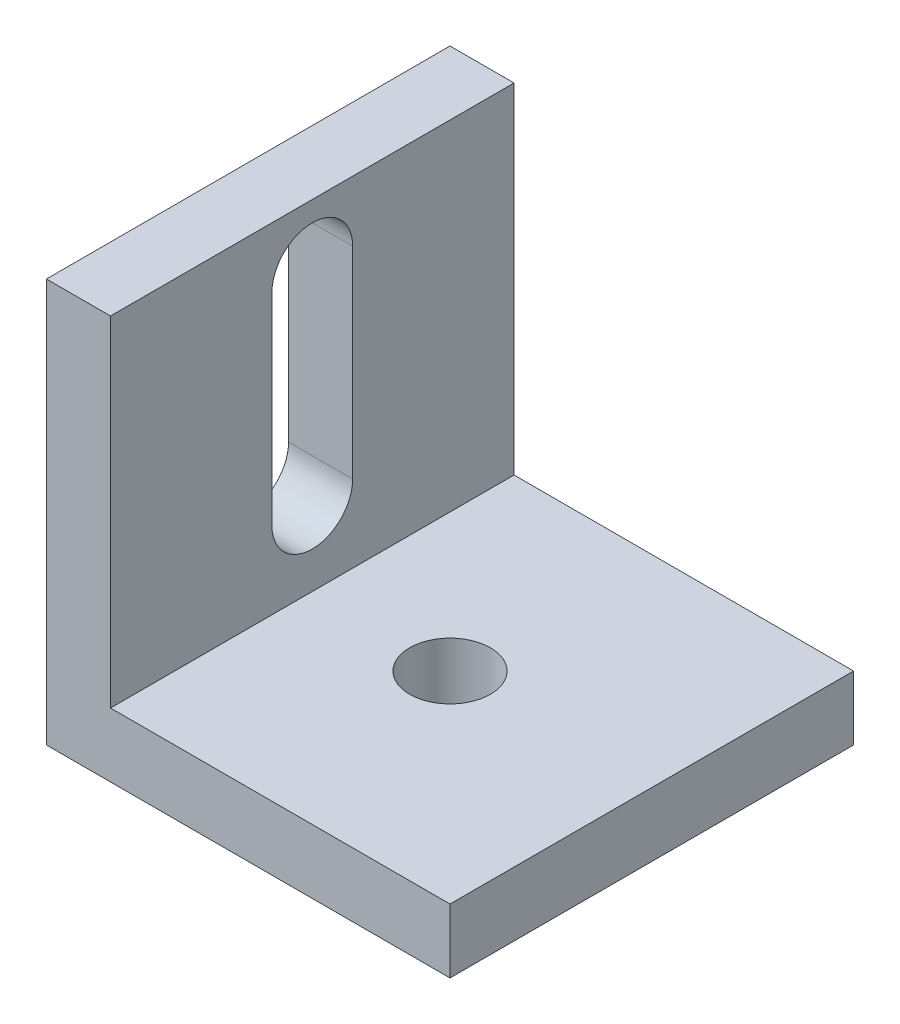
ISO-10303-21;
HEADER;
FILE_DESCRIPTION(('STEP AP214'),'2;1');
FILE_NAME('part.step','',(''),(''),'','','');
FILE_SCHEMA(('AUTOMOTIVE_DESIGN { 1 0 10303 214 1 1 1 1 }'));
ENDSEC;
DATA;
#1=APPLICATION_CONTEXT('core data for automotive mechanical design processes');
#2=APPLICATION_PROTOCOL_DEFINITION('international standard','automotive_design',2000,#1);
#3=PRODUCT_CONTEXT('',#1,'mechanical');
#4=PRODUCT('Part','Part','',(#3));
#5=PRODUCT_RELATED_PRODUCT_CATEGORY('part','',(#4));
#6=PRODUCT_DEFINITION_FORMATION('','',#4);
#7=PRODUCT_DEFINITION_CONTEXT('part definition',#1,'design');
#8=PRODUCT_DEFINITION('design','',#6,#7);
#9=PRODUCT_DEFINITION_SHAPE('','',#8);
#10=(LENGTH_UNIT() NAMED_UNIT(*) SI_UNIT(.MILLI.,.METRE.));
#11=(NAMED_UNIT(*) PLANE_ANGLE_UNIT() SI_UNIT($,.RADIAN.));
#12=(NAMED_UNIT(*) SI_UNIT($,.STERADIAN.) SOLID_ANGLE_UNIT());
#13=UNCERTAINTY_MEASURE_WITH_UNIT(LENGTH_MEASURE(1.E-05),#10,'distance_accuracy_value','');
#14=(GEOMETRIC_REPRESENTATION_CONTEXT(3) GLOBAL_UNCERTAINTY_ASSIGNED_CONTEXT((#13)) GLOBAL_UNIT_ASSIGNED_CONTEXT((#10,
#11,#12)) REPRESENTATION_CONTEXT('',''));
#15=CARTESIAN_POINT('',(0.,0.,0.));
#16=DIRECTION('',(0.,0.,1.));
#17=DIRECTION('',(1.,0.,0.));
#18=AXIS2_PLACEMENT_3D('',#15,#16,#17);
#19=CARTESIAN_POINT('',(16.825,0.,-10.));
#20=DIRECTION('',(0.,1.,0.));
#21=DIRECTION('',(-1.,0.,0.));
#22=AXIS2_PLACEMENT_3D('',#19,#20,#21);
#23=PLANE('',#22);
#24=CARTESIAN_POINT('',(6.825,0.,0.));
#25=DIRECTION('',(0.,1.,0.));
#26=DIRECTION('',(0.,0.,1.));
#27=AXIS2_PLACEMENT_3D('',#24,#25,#26);
#28=CIRCLE('',#27,2.);
#29=CARTESIAN_POINT('',(6.825,0.,2.));
#30=VERTEX_POINT('',#29);
#31=EDGE_CURVE('E145',#30,#30,#28,.T.);
#32=ORIENTED_EDGE('',*,*,#31,.F.);
#33=EDGE_LOOP('',(#32));
#34=FACE_BOUND('',#33,.T.);
#35=DIRECTION('',(0.,0.,1.));
#36=VECTOR('',#35,1.);
#37=CARTESIAN_POINT('',(0.,0.,-10.));
#38=LINE('',#37,#36);
#39=CARTESIAN_POINT('',(0.,0.,-10.));
#40=VERTEX_POINT('',#39);
#41=CARTESIAN_POINT('',(0.,0.,10.));
#42=VERTEX_POINT('',#41);
#43=EDGE_CURVE('E183',#40,#42,#38,.T.);
#44=ORIENTED_EDGE('',*,*,#43,.T.);
#45=DIRECTION('',(-1.,0.,0.));
#46=VECTOR('',#45,1.);
#47=CARTESIAN_POINT('',(16.825,0.,10.));
#48=LINE('',#47,#46);
#49=CARTESIAN_POINT('',(16.825,0.,10.));
#50=VERTEX_POINT('',#49);
#51=EDGE_CURVE('E148',#50,#42,#48,.T.);
#52=ORIENTED_EDGE('',*,*,#51,.F.);
#53=DIRECTION('',(0.,0.,1.));
#54=VECTOR('',#53,1.);
#55=CARTESIAN_POINT('',(16.825,0.,-10.));
#56=LINE('',#55,#54);
#57=CARTESIAN_POINT('',(16.825,0.,-10.));
#58=VERTEX_POINT('',#57);
#59=EDGE_CURVE('E11',#58,#50,#56,.T.);
#60=ORIENTED_EDGE('',*,*,#59,.F.);
#61=DIRECTION('',(-1.,0.,0.));
#62=VECTOR('',#61,1.);
#63=CARTESIAN_POINT('',(16.825,0.,-10.));
#64=LINE('',#63,#62);
#65=EDGE_CURVE('E166',#58,#40,#64,.T.);
#66=ORIENTED_EDGE('',*,*,#65,.T.);
#67=EDGE_LOOP('',(#44,#52,#60,#66));
#68=FACE_BOUND('',#67,.T.);
#69=ADVANCED_FACE('F33',(#34,#68),#23,.T.);
#70=CARTESIAN_POINT('',(16.825,-3.175,-10.));
#71=DIRECTION('',(1.,0.,0.));
#72=DIRECTION('',(0.,0.,-1.));
#73=AXIS2_PLACEMENT_3D('',#70,#71,#72);
#74=PLANE('',#73);
#75=ORIENTED_EDGE('',*,*,#59,.T.);
#76=DIRECTION('',(0.,1.,0.));
#77=VECTOR('',#76,1.);
#78=CARTESIAN_POINT('',(16.825,-3.175,10.));
#79=LINE('',#78,#77);
#80=CARTESIAN_POINT('',(16.825,-3.175,10.));
#81=VERTEX_POINT('',#80);
#82=EDGE_CURVE('E163',#81,#50,#79,.T.);
#83=ORIENTED_EDGE('',*,*,#82,.F.);
#84=DIRECTION('',(0.,0.,1.));
#85=VECTOR('',#84,1.);
#86=CARTESIAN_POINT('',(16.825,-3.175,-10.));
#87=LINE('',#86,#85);
#88=CARTESIAN_POINT('',(16.825,-3.175,-10.));
#89=VERTEX_POINT('',#88);
#90=EDGE_CURVE('E41',#89,#81,#87,.T.);
#91=ORIENTED_EDGE('',*,*,#90,.F.);
#92=DIRECTION('',(0.,1.,0.));
#93=VECTOR('',#92,1.);
#94=CARTESIAN_POINT('',(16.825,-3.175,-10.));
#95=LINE('',#94,#93);
#96=EDGE_CURVE('E181',#89,#58,#95,.T.);
#97=ORIENTED_EDGE('',*,*,#96,.T.);
#98=EDGE_LOOP('',(#75,#83,#91,#97));
#99=FACE_BOUND('',#98,.T.);
#100=ADVANCED_FACE('F202',(#99),#74,.T.);
#101=CARTESIAN_POINT('',(-3.175,-3.175,-10.));
#102=DIRECTION('',(0.,-1.,0.));
#103=DIRECTION('',(1.,0.,0.));
#104=AXIS2_PLACEMENT_3D('',#101,#102,#103);
#105=PLANE('',#104);
#106=CARTESIAN_POINT('',(6.825,-3.175,0.));
#107=DIRECTION('',(0.,-1.,0.));
#108=DIRECTION('',(1.,0.,0.));
#109=AXIS2_PLACEMENT_3D('',#106,#107,#108);
#110=CIRCLE('',#109,2.);
#111=CARTESIAN_POINT('',(8.825,-3.175,0.));
#112=VERTEX_POINT('',#111);
#113=EDGE_CURVE('E36',#112,#112,#110,.T.);
#114=ORIENTED_EDGE('',*,*,#113,.F.);
#115=EDGE_LOOP('',(#114));
#116=FACE_BOUND('',#115,.T.);
#117=ORIENTED_EDGE('',*,*,#90,.T.);
#118=DIRECTION('',(1.,0.,0.));
#119=VECTOR('',#118,1.);
#120=CARTESIAN_POINT('',(-3.175,-3.175,10.));
#121=LINE('',#120,#119);
#122=CARTESIAN_POINT('',(-3.175,-3.175,10.));
#123=VERTEX_POINT('',#122);
#124=EDGE_CURVE('E160',#123,#81,#121,.T.);
#125=ORIENTED_EDGE('',*,*,#124,.F.);
#126=DIRECTION('',(0.,0.,1.));
#127=VECTOR('',#126,1.);
#128=CARTESIAN_POINT('',(-3.175,-3.175,-10.));
#129=LINE('',#128,#127);
#130=CARTESIAN_POINT('',(-3.175,-3.175,-10.));
#131=VERTEX_POINT('',#130);
#132=EDGE_CURVE('E186',#131,#123,#129,.T.);
#133=ORIENTED_EDGE('',*,*,#132,.F.);
#134=DIRECTION('',(1.,0.,0.));
#135=VECTOR('',#134,1.);
#136=CARTESIAN_POINT('',(-3.175,-3.175,-10.));
#137=LINE('',#136,#135);
#138=EDGE_CURVE('E178',#131,#89,#137,.T.);
#139=ORIENTED_EDGE('',*,*,#138,.T.);
#140=EDGE_LOOP('',(#117,#125,#133,#139));
#141=FACE_BOUND('',#140,.T.);
#142=ADVANCED_FACE('F215',(#116,#141),#105,.T.);
#143=CARTESIAN_POINT('',(-3.175,16.825,-10.));
#144=DIRECTION('',(-1.,0.,0.));
#145=DIRECTION('',(0.,-1.,0.));
#146=AXIS2_PLACEMENT_3D('',#143,#144,#145);
#147=PLANE('',#146);
#148=CARTESIAN_POINT('',(-3.175,13.825,0.));
#149=DIRECTION('',(-1.,0.,0.));
#150=DIRECTION('',(0.,-1.,0.));
#151=AXIS2_PLACEMENT_3D('',#148,#149,#150);
#152=CIRCLE('',#151,2.);
#153=CARTESIAN_POINT('',(-3.175,13.825,2.));
#154=VERTEX_POINT('',#153);
#155=CARTESIAN_POINT('',(-3.175,13.825,-2.));
#156=VERTEX_POINT('',#155);
#157=EDGE_CURVE('E143',#154,#156,#152,.T.);
#158=ORIENTED_EDGE('',*,*,#157,.F.);
#159=DIRECTION('',(0.,1.,0.));
#160=VECTOR('',#159,1.);
#161=CARTESIAN_POINT('',(-3.175,16.825,2.));
#162=LINE('',#161,#160);
#163=CARTESIAN_POINT('',(-3.175,3.825,2.));
#164=VERTEX_POINT('',#163);
#165=EDGE_CURVE('E136',#164,#154,#162,.T.);
#166=ORIENTED_EDGE('',*,*,#165,.F.);
#167=CARTESIAN_POINT('',(-3.175,3.825,0.));
#168=DIRECTION('',(-1.,0.,0.));
#169=DIRECTION('',(0.,-1.,0.));
#170=AXIS2_PLACEMENT_3D('',#167,#168,#169);
#171=CIRCLE('',#170,2.);
#172=CARTESIAN_POINT('',(-3.175,3.825,-2.));
#173=VERTEX_POINT('',#172);
#174=EDGE_CURVE('E116',#173,#164,#171,.T.);
#175=ORIENTED_EDGE('',*,*,#174,.F.);
#176=DIRECTION('',(0.,-1.,0.));
#177=VECTOR('',#176,1.);
#178=CARTESIAN_POINT('',(-3.175,16.825,-1.99999999999999));
#179=LINE('',#178,#177);
#180=EDGE_CURVE('E141',#156,#173,#179,.T.);
#181=ORIENTED_EDGE('',*,*,#180,.F.);
#182=EDGE_LOOP('',(#158,#166,#175,#181));
#183=FACE_BOUND('',#182,.T.);
#184=ORIENTED_EDGE('',*,*,#132,.T.);
#185=DIRECTION('',(0.,-1.,0.));
#186=VECTOR('',#185,1.);
#187=CARTESIAN_POINT('',(-3.175,16.825,10.));
#188=LINE('',#187,#186);
#189=CARTESIAN_POINT('',(-3.175,16.825,10.));
#190=VERTEX_POINT('',#189);
#191=EDGE_CURVE('E157',#190,#123,#188,.T.);
#192=ORIENTED_EDGE('',*,*,#191,.F.);
#193=DIRECTION('',(0.,0.,1.));
#194=VECTOR('',#193,1.);
#195=CARTESIAN_POINT('',(-3.175,16.825,-10.));
#196=LINE('',#195,#194);
#197=CARTESIAN_POINT('',(-3.175,16.825,-10.));
#198=VERTEX_POINT('',#197);
#199=EDGE_CURVE('E188',#198,#190,#196,.T.);
#200=ORIENTED_EDGE('',*,*,#199,.F.);
#201=DIRECTION('',(0.,-1.,0.));
#202=VECTOR('',#201,1.);
#203=CARTESIAN_POINT('',(-3.175,16.825,-10.));
#204=LINE('',#203,#202);
#205=EDGE_CURVE('E175',#198,#131,#204,.T.);
#206=ORIENTED_EDGE('',*,*,#205,.T.);
#207=EDGE_LOOP('',(#184,#192,#200,#206));
#208=FACE_BOUND('',#207,.T.);
#209=ADVANCED_FACE('F213',(#183,#208),#147,.T.);
#210=CARTESIAN_POINT('',(0.,16.825,-10.));
#211=DIRECTION('',(0.,1.,0.));
#212=DIRECTION('',(-1.,0.,0.));
#213=AXIS2_PLACEMENT_3D('',#210,#211,#212);
#214=PLANE('',#213);
#215=ORIENTED_EDGE('',*,*,#199,.T.);
#216=DIRECTION('',(-1.,0.,0.));
#217=VECTOR('',#216,1.);
#218=CARTESIAN_POINT('',(0.,16.825,10.));
#219=LINE('',#218,#217);
#220=CARTESIAN_POINT('',(0.,16.825,10.));
#221=VERTEX_POINT('',#220);
#222=EDGE_CURVE('E154',#221,#190,#219,.T.);
#223=ORIENTED_EDGE('',*,*,#222,.F.);
#224=DIRECTION('',(0.,0.,1.));
#225=VECTOR('',#224,1.);
#226=CARTESIAN_POINT('',(0.,16.825,-10.));
#227=LINE('',#226,#225);
#228=CARTESIAN_POINT('',(0.,16.825,-10.));
#229=VERTEX_POINT('',#228);
#230=EDGE_CURVE('E190',#229,#221,#227,.T.);
#231=ORIENTED_EDGE('',*,*,#230,.F.);
#232=DIRECTION('',(-1.,0.,0.));
#233=VECTOR('',#232,1.);
#234=CARTESIAN_POINT('',(0.,16.825,-10.));
#235=LINE('',#234,#233);
#236=EDGE_CURVE('E172',#229,#198,#235,.T.);
#237=ORIENTED_EDGE('',*,*,#236,.T.);
#238=EDGE_LOOP('',(#215,#223,#231,#237));
#239=FACE_BOUND('',#238,.T.);
#240=ADVANCED_FACE('F210',(#239),#214,.T.);
#241=CARTESIAN_POINT('',(0.,0.,-10.));
#242=DIRECTION('',(1.,0.,0.));
#243=DIRECTION('',(0.,1.,0.));
#244=AXIS2_PLACEMENT_3D('',#241,#242,#243);
#245=PLANE('',#244);
#246=CARTESIAN_POINT('',(0.,13.825,0.));
#247=DIRECTION('',(1.,0.,0.));
#248=DIRECTION('',(0.,0.,-1.));
#249=AXIS2_PLACEMENT_3D('',#246,#247,#248);
#250=CIRCLE('',#249,2.);
#251=CARTESIAN_POINT('',(0.,13.825,-2.));
#252=VERTEX_POINT('',#251);
#253=CARTESIAN_POINT('',(0.,13.825,2.));
#254=VERTEX_POINT('',#253);
#255=EDGE_CURVE('E57',#252,#254,#250,.T.);
#256=ORIENTED_EDGE('',*,*,#255,.F.);
#257=DIRECTION('',(0.,1.,0.));
#258=VECTOR('',#257,1.);
#259=CARTESIAN_POINT('',(0.,13.825,-2.));
#260=LINE('',#259,#258);
#261=CARTESIAN_POINT('',(0.,3.825,-2.));
#262=VERTEX_POINT('',#261);
#263=EDGE_CURVE('E129',#262,#252,#260,.T.);
#264=ORIENTED_EDGE('',*,*,#263,.F.);
#265=CARTESIAN_POINT('',(0.,3.825,0.));
#266=DIRECTION('',(1.,0.,0.));
#267=DIRECTION('',(0.,0.,-1.));
#268=AXIS2_PLACEMENT_3D('',#265,#266,#267);
#269=CIRCLE('',#268,2.);
#270=CARTESIAN_POINT('',(0.,3.825,2.));
#271=VERTEX_POINT('',#270);
#272=EDGE_CURVE('E113',#271,#262,#269,.T.);
#273=ORIENTED_EDGE('',*,*,#272,.F.);
#274=DIRECTION('',(0.,-1.,0.));
#275=VECTOR('',#274,1.);
#276=CARTESIAN_POINT('',(0.,13.825,2.));
#277=LINE('',#276,#275);
#278=EDGE_CURVE('E122',#254,#271,#277,.T.);
#279=ORIENTED_EDGE('',*,*,#278,.F.);
#280=EDGE_LOOP('',(#256,#264,#273,#279));
#281=FACE_BOUND('',#280,.T.);
#282=ORIENTED_EDGE('',*,*,#230,.T.);
#283=DIRECTION('',(0.,1.,0.));
#284=VECTOR('',#283,1.);
#285=CARTESIAN_POINT('',(0.,0.,10.));
#286=LINE('',#285,#284);
#287=EDGE_CURVE('E151',#42,#221,#286,.T.);
#288=ORIENTED_EDGE('',*,*,#287,.F.);
#289=ORIENTED_EDGE('',*,*,#43,.F.);
#290=DIRECTION('',(0.,1.,0.));
#291=VECTOR('',#290,1.);
#292=CARTESIAN_POINT('',(0.,0.,-10.));
#293=LINE('',#292,#291);
#294=EDGE_CURVE('E169',#40,#229,#293,.T.);
#295=ORIENTED_EDGE('',*,*,#294,.T.);
#296=EDGE_LOOP('',(#282,#288,#289,#295));
#297=FACE_BOUND('',#296,.T.);
#298=ADVANCED_FACE('F126',(#281,#297),#245,.T.);
#299=CARTESIAN_POINT('',(0.,0.,-10.));
#300=DIRECTION('',(0.,0.,-1.));
#301=DIRECTION('',(-1.,0.,0.));
#302=AXIS2_PLACEMENT_3D('',#299,#300,#301);
#303=PLANE('',#302);
#304=ORIENTED_EDGE('',*,*,#65,.F.);
#305=ORIENTED_EDGE('',*,*,#96,.F.);
#306=ORIENTED_EDGE('',*,*,#138,.F.);
#307=ORIENTED_EDGE('',*,*,#205,.F.);
#308=ORIENTED_EDGE('',*,*,#236,.F.);
#309=ORIENTED_EDGE('',*,*,#294,.F.);
#310=EDGE_LOOP('',(#304,#305,#306,#307,#308,#309));
#311=FACE_BOUND('',#310,.T.);
#312=ADVANCED_FACE('F205',(#311),#303,.T.);
#313=CARTESIAN_POINT('',(0.,0.,10.));
#314=DIRECTION('',(0.,0.,-1.));
#315=DIRECTION('',(-1.,0.,0.));
#316=AXIS2_PLACEMENT_3D('',#313,#314,#315);
#317=PLANE('',#316);
#318=ORIENTED_EDGE('',*,*,#51,.T.);
#319=ORIENTED_EDGE('',*,*,#287,.T.);
#320=ORIENTED_EDGE('',*,*,#222,.T.);
#321=ORIENTED_EDGE('',*,*,#191,.T.);
#322=ORIENTED_EDGE('',*,*,#124,.T.);
#323=ORIENTED_EDGE('',*,*,#82,.T.);
#324=EDGE_LOOP('',(#318,#319,#320,#321,#322,#323));
#325=FACE_BOUND('',#324,.T.);
#326=ADVANCED_FACE('F198',(#325),#317,.F.);
#327=CARTESIAN_POINT('',(6.825,-10.,0.));
#328=DIRECTION('',(0.,1.,0.));
#329=DIRECTION('',(0.,0.,1.));
#330=AXIS2_PLACEMENT_3D('',#327,#328,#329);
#331=CYLINDRICAL_SURFACE('',#330,2.);
#332=ORIENTED_EDGE('',*,*,#113,.T.);
#333=EDGE_LOOP('',(#332));
#334=FACE_BOUND('',#333,.T.);
#335=ORIENTED_EDGE('',*,*,#31,.T.);
#336=EDGE_LOOP('',(#335));
#337=FACE_BOUND('',#336,.T.);
#338=ADVANCED_FACE('F233',(#334,#337),#331,.F.);
#339=CARTESIAN_POINT('',(-10.,13.825,0.));
#340=DIRECTION('',(1.,0.,0.));
#341=DIRECTION('',(0.,0.,-1.));
#342=AXIS2_PLACEMENT_3D('',#339,#340,#341);
#343=CYLINDRICAL_SURFACE('',#342,2.);
#344=ORIENTED_EDGE('',*,*,#157,.T.);
#345=DIRECTION('',(1.,0.,0.));
#346=VECTOR('',#345,1.);
#347=CARTESIAN_POINT('',(-10.,13.825,-2.));
#348=LINE('',#347,#346);
#349=EDGE_CURVE('E134',#156,#252,#348,.T.);
#350=ORIENTED_EDGE('',*,*,#349,.T.);
#351=ORIENTED_EDGE('',*,*,#255,.T.);
#352=DIRECTION('',(1.,0.,0.));
#353=VECTOR('',#352,1.);
#354=CARTESIAN_POINT('',(-10.,13.825,2.));
#355=LINE('',#354,#353);
#356=EDGE_CURVE('E119',#154,#254,#355,.T.);
#357=ORIENTED_EDGE('',*,*,#356,.F.);
#358=EDGE_LOOP('',(#344,#350,#351,#357));
#359=FACE_BOUND('',#358,.T.);
#360=ADVANCED_FACE('F235',(#359),#343,.F.);
#361=CARTESIAN_POINT('',(-10.,13.825,-2.));
#362=DIRECTION('',(0.,0.,-1.));
#363=DIRECTION('',(0.,1.,0.));
#364=AXIS2_PLACEMENT_3D('',#361,#362,#363);
#365=PLANE('',#364);
#366=ORIENTED_EDGE('',*,*,#180,.T.);
#367=DIRECTION('',(1.,0.,0.));
#368=VECTOR('',#367,1.);
#369=CARTESIAN_POINT('',(-10.,3.825,-2.));
#370=LINE('',#369,#368);
#371=EDGE_CURVE('E118',#173,#262,#370,.T.);
#372=ORIENTED_EDGE('',*,*,#371,.T.);
#373=ORIENTED_EDGE('',*,*,#263,.T.);
#374=ORIENTED_EDGE('',*,*,#349,.F.);
#375=EDGE_LOOP('',(#366,#372,#373,#374));
#376=FACE_BOUND('',#375,.T.);
#377=ADVANCED_FACE('F242',(#376),#365,.F.);
#378=CARTESIAN_POINT('',(-10.,3.825,0.));
#379=DIRECTION('',(1.,0.,0.));
#380=DIRECTION('',(0.,0.,-1.));
#381=AXIS2_PLACEMENT_3D('',#378,#379,#380);
#382=CYLINDRICAL_SURFACE('',#381,2.);
#383=ORIENTED_EDGE('',*,*,#174,.T.);
#384=DIRECTION('',(1.,0.,0.));
#385=VECTOR('',#384,1.);
#386=CARTESIAN_POINT('',(-10.,3.825,2.));
#387=LINE('',#386,#385);
#388=EDGE_CURVE('E49',#164,#271,#387,.T.);
#389=ORIENTED_EDGE('',*,*,#388,.T.);
#390=ORIENTED_EDGE('',*,*,#272,.T.);
#391=ORIENTED_EDGE('',*,*,#371,.F.);
#392=EDGE_LOOP('',(#383,#389,#390,#391));
#393=FACE_BOUND('',#392,.T.);
#394=ADVANCED_FACE('F110',(#393),#382,.F.);
#395=CARTESIAN_POINT('',(-10.,13.825,2.));
#396=DIRECTION('',(0.,0.,1.));
#397=DIRECTION('',(0.,-1.,0.));
#398=AXIS2_PLACEMENT_3D('',#395,#396,#397);
#399=PLANE('',#398);
#400=ORIENTED_EDGE('',*,*,#165,.T.);
#401=ORIENTED_EDGE('',*,*,#356,.T.);
#402=ORIENTED_EDGE('',*,*,#278,.T.);
#403=ORIENTED_EDGE('',*,*,#388,.F.);
#404=EDGE_LOOP('',(#400,#401,#402,#403));
#405=FACE_BOUND('',#404,.T.);
#406=ADVANCED_FACE('F123',(#405),#399,.F.);
#407=CLOSED_SHELL('',(#69,#100,#142,#209,#240,#298,#312,#326,#338,#360,#377,#394,#406));
#408=MANIFOLD_SOLID_BREP('B2',#407);
#409=ADVANCED_BREP_SHAPE_REPRESENTATION('',(#18,#408),#14);
#410=SHAPE_DEFINITION_REPRESENTATION(#9,#409);
ENDSEC;
END-ISO-10303-21;
